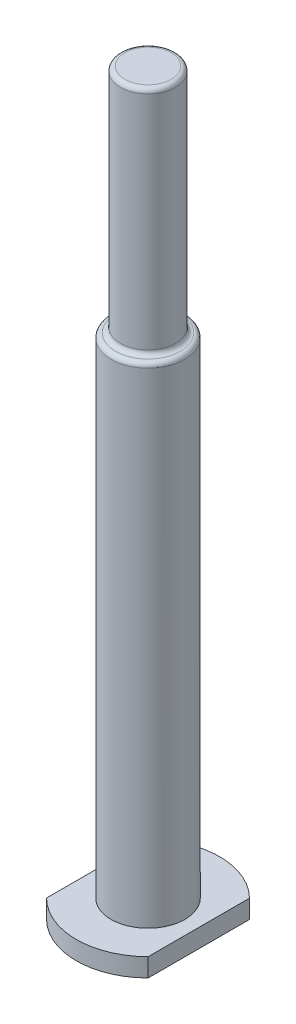
ISO-10303-21;
HEADER;
FILE_DESCRIPTION(('STEP AP214'),'2;1');
FILE_NAME('part.step','',(''),(''),'','','');
FILE_SCHEMA(('AUTOMOTIVE_DESIGN { 1 0 10303 214 1 1 1 1 }'));
ENDSEC;
DATA;
#1=APPLICATION_CONTEXT('core data for automotive mechanical design processes');
#2=APPLICATION_PROTOCOL_DEFINITION('international standard','automotive_design',2000,#1);
#3=PRODUCT_CONTEXT('',#1,'mechanical');
#4=PRODUCT('Part','Part','',(#3));
#5=PRODUCT_RELATED_PRODUCT_CATEGORY('part','',(#4));
#6=PRODUCT_DEFINITION_FORMATION('','',#4);
#7=PRODUCT_DEFINITION_CONTEXT('part definition',#1,'design');
#8=PRODUCT_DEFINITION('design','',#6,#7);
#9=PRODUCT_DEFINITION_SHAPE('','',#8);
#10=(LENGTH_UNIT() NAMED_UNIT(*) SI_UNIT(.MILLI.,.METRE.));
#11=(NAMED_UNIT(*) PLANE_ANGLE_UNIT() SI_UNIT($,.RADIAN.));
#12=(NAMED_UNIT(*) SI_UNIT($,.STERADIAN.) SOLID_ANGLE_UNIT());
#13=UNCERTAINTY_MEASURE_WITH_UNIT(LENGTH_MEASURE(1.E-05),#10,'distance_accuracy_value','');
#14=(GEOMETRIC_REPRESENTATION_CONTEXT(3) GLOBAL_UNCERTAINTY_ASSIGNED_CONTEXT((#13)) GLOBAL_UNIT_ASSIGNED_CONTEXT((#10,
#11,#12)) REPRESENTATION_CONTEXT('',''));
#15=CARTESIAN_POINT('',(0.,0.,0.));
#16=DIRECTION('',(0.,0.,1.));
#17=DIRECTION('',(1.,0.,0.));
#18=AXIS2_PLACEMENT_3D('',#15,#16,#17);
#19=CARTESIAN_POINT('',(0.,26.25,0.));
#20=DIRECTION('',(0.,1.,0.));
#21=DIRECTION('',(0.,0.,-1.));
#22=AXIS2_PLACEMENT_3D('',#19,#20,#21);
#23=CYLINDRICAL_SURFACE('',#22,4.);
#24=CARTESIAN_POINT('',(0.,52.5,0.));
#25=DIRECTION('',(0.,1.,0.));
#26=DIRECTION('',(1.,0.,0.));
#27=AXIS2_PLACEMENT_3D('',#24,#25,#26);
#28=CIRCLE('',#27,4.);
#29=CARTESIAN_POINT('',(0.,52.5,-4.));
#30=VERTEX_POINT('',#29);
#31=CARTESIAN_POINT('',(0.,52.5,4.));
#32=VERTEX_POINT('',#31);
#33=EDGE_CURVE('E117',#30,#32,#28,.T.);
#34=ORIENTED_EDGE('',*,*,#33,.F.);
#35=CARTESIAN_POINT('',(0.,52.5,0.));
#36=DIRECTION('',(0.,1.,0.));
#37=DIRECTION('',(1.,0.,0.));
#38=AXIS2_PLACEMENT_3D('',#35,#36,#37);
#39=CIRCLE('',#38,4.);
#40=EDGE_CURVE('E115',#32,#30,#39,.T.);
#41=ORIENTED_EDGE('',*,*,#40,.F.);
#42=DIRECTION('',(0.,-1.,0.));
#43=VECTOR('',#42,1.);
#44=CARTESIAN_POINT('',(0.,26.25,4.));
#45=LINE('',#44,#43);
#46=CARTESIAN_POINT('',(0.,0.,4.));
#47=VERTEX_POINT('',#46);
#48=EDGE_CURVE('E11',#32,#47,#45,.T.);
#49=ORIENTED_EDGE('',*,*,#48,.T.);
#50=CARTESIAN_POINT('',(0.,0.,0.));
#51=DIRECTION('',(0.,1.,0.));
#52=DIRECTION('',(1.,0.,0.));
#53=AXIS2_PLACEMENT_3D('',#50,#51,#52);
#54=CIRCLE('',#53,4.);
#55=EDGE_CURVE('E114',#47,#47,#54,.T.);
#56=ORIENTED_EDGE('',*,*,#55,.T.);
#57=ORIENTED_EDGE('',*,*,#48,.F.);
#58=EDGE_LOOP('',(#34,#41,#49,#56,#57));
#59=FACE_BOUND('',#58,.T.);
#60=ADVANCED_FACE('F17',(#59),#23,.T.);
#61=CARTESIAN_POINT('',(0.,78.,0.));
#62=DIRECTION('',(0.,1.,0.));
#63=DIRECTION('',(1.,0.,0.));
#64=AXIS2_PLACEMENT_3D('',#61,#62,#63);
#65=PLANE('',#64);
#66=CARTESIAN_POINT('',(0.,78.,0.));
#67=DIRECTION('',(0.,1.,0.));
#68=DIRECTION('',(1.,0.,0.));
#69=AXIS2_PLACEMENT_3D('',#66,#67,#68);
#70=CIRCLE('',#69,2.5);
#71=CARTESIAN_POINT('',(0.,78.,-2.5));
#72=VERTEX_POINT('',#71);
#73=EDGE_CURVE('E178',#72,#72,#70,.T.);
#74=ORIENTED_EDGE('',*,*,#73,.T.);
#75=EDGE_LOOP('',(#74));
#76=FACE_BOUND('',#75,.T.);
#77=ADVANCED_FACE('F231',(#76),#65,.T.);
#78=CARTESIAN_POINT('',(0.,77.5,0.));
#79=DIRECTION('',(0.,1.,0.));
#80=DIRECTION('',(0.,0.,1.));
#81=AXIS2_PLACEMENT_3D('',#78,#79,#80);
#82=TOROIDAL_SURFACE('',#81,2.5,0.5);
#83=ORIENTED_EDGE('',*,*,#73,.F.);
#84=CARTESIAN_POINT('',(0.,77.5,-2.5));
#85=DIRECTION('',(-1.,0.,0.));
#86=DIRECTION('',(0.,0.,-1.));
#87=AXIS2_PLACEMENT_3D('',#84,#85,#86);
#88=CIRCLE('',#87,0.5);
#89=CARTESIAN_POINT('',(0.,77.5,-3.));
#90=VERTEX_POINT('',#89);
#91=EDGE_CURVE('E27',#72,#90,#88,.T.);
#92=ORIENTED_EDGE('',*,*,#91,.T.);
#93=CARTESIAN_POINT('',(0.,77.5,0.));
#94=DIRECTION('',(0.,1.,0.));
#95=DIRECTION('',(1.,0.,0.));
#96=AXIS2_PLACEMENT_3D('',#93,#94,#95);
#97=CIRCLE('',#96,3.);
#98=CARTESIAN_POINT('',(0.,77.5,3.));
#99=VERTEX_POINT('',#98);
#100=EDGE_CURVE('E155',#90,#99,#97,.T.);
#101=ORIENTED_EDGE('',*,*,#100,.T.);
#102=CARTESIAN_POINT('',(0.,77.5,0.));
#103=DIRECTION('',(0.,1.,0.));
#104=DIRECTION('',(1.,0.,0.));
#105=AXIS2_PLACEMENT_3D('',#102,#103,#104);
#106=CIRCLE('',#105,3.);
#107=EDGE_CURVE('E159',#99,#90,#106,.T.);
#108=ORIENTED_EDGE('',*,*,#107,.T.);
#109=ORIENTED_EDGE('',*,*,#91,.F.);
#110=EDGE_LOOP('',(#83,#92,#101,#108,#109));
#111=FACE_BOUND('',#110,.T.);
#112=ADVANCED_FACE('F221',(#111),#82,.T.);
#113=CARTESIAN_POINT('',(0.,65.5,0.));
#114=DIRECTION('',(0.,1.,0.));
#115=DIRECTION('',(0.,0.,-1.));
#116=AXIS2_PLACEMENT_3D('',#113,#114,#115);
#117=CYLINDRICAL_SURFACE('',#116,3.);
#118=ORIENTED_EDGE('',*,*,#100,.F.);
#119=ORIENTED_EDGE('',*,*,#107,.F.);
#120=DIRECTION('',(0.,-1.,0.));
#121=VECTOR('',#120,1.);
#122=CARTESIAN_POINT('',(0.,65.5,3.));
#123=LINE('',#122,#121);
#124=CARTESIAN_POINT('',(0.,53.5,3.));
#125=VERTEX_POINT('',#124);
#126=EDGE_CURVE('E179',#99,#125,#123,.T.);
#127=ORIENTED_EDGE('',*,*,#126,.T.);
#128=CARTESIAN_POINT('',(0.,53.5,0.));
#129=DIRECTION('',(0.,1.,0.));
#130=DIRECTION('',(1.,0.,0.));
#131=AXIS2_PLACEMENT_3D('',#128,#129,#130);
#132=CIRCLE('',#131,3.);
#133=CARTESIAN_POINT('',(0.,53.5,-3.));
#134=VERTEX_POINT('',#133);
#135=EDGE_CURVE('E188',#125,#134,#132,.T.);
#136=ORIENTED_EDGE('',*,*,#135,.T.);
#137=CARTESIAN_POINT('',(0.,53.5,0.));
#138=DIRECTION('',(0.,1.,0.));
#139=DIRECTION('',(1.,0.,0.));
#140=AXIS2_PLACEMENT_3D('',#137,#138,#139);
#141=CIRCLE('',#140,3.);
#142=EDGE_CURVE('E160',#134,#125,#141,.T.);
#143=ORIENTED_EDGE('',*,*,#142,.T.);
#144=ORIENTED_EDGE('',*,*,#126,.F.);
#145=EDGE_LOOP('',(#118,#119,#127,#136,#143,#144));
#146=FACE_BOUND('',#145,.T.);
#147=ADVANCED_FACE('F223',(#146),#117,.T.);
#148=CARTESIAN_POINT('',(0.,53.5,0.));
#149=DIRECTION('',(0.,1.,0.));
#150=DIRECTION('',(0.,0.,1.));
#151=AXIS2_PLACEMENT_3D('',#148,#149,#150);
#152=TOROIDAL_SURFACE('',#151,3.5,0.499999999999994);
#153=CARTESIAN_POINT('',(0.,53.,0.));
#154=DIRECTION('',(0.,1.,0.));
#155=DIRECTION('',(1.,0.,0.));
#156=AXIS2_PLACEMENT_3D('',#153,#154,#155);
#157=CIRCLE('',#156,3.5);
#158=CARTESIAN_POINT('',(0.,53.,-3.5));
#159=VERTEX_POINT('',#158);
#160=EDGE_CURVE('E124',#159,#159,#157,.T.);
#161=ORIENTED_EDGE('',*,*,#160,.T.);
#162=CARTESIAN_POINT('',(0.,53.5,-3.5));
#163=DIRECTION('',(-1.,0.,0.));
#164=DIRECTION('',(0.,0.,-1.));
#165=AXIS2_PLACEMENT_3D('',#162,#163,#164);
#166=CIRCLE('',#165,0.499999999999994);
#167=EDGE_CURVE('E20',#159,#134,#166,.T.);
#168=ORIENTED_EDGE('',*,*,#167,.T.);
#169=ORIENTED_EDGE('',*,*,#135,.F.);
#170=ORIENTED_EDGE('',*,*,#142,.F.);
#171=ORIENTED_EDGE('',*,*,#167,.F.);
#172=EDGE_LOOP('',(#161,#168,#169,#170,#171));
#173=FACE_BOUND('',#172,.T.);
#174=ADVANCED_FACE('F217',(#173),#152,.F.);
#175=CARTESIAN_POINT('',(0.,52.5,0.));
#176=DIRECTION('',(0.,1.,0.));
#177=DIRECTION('',(0.,0.,1.));
#178=AXIS2_PLACEMENT_3D('',#175,#176,#177);
#179=TOROIDAL_SURFACE('',#178,3.5,0.5);
#180=ORIENTED_EDGE('',*,*,#160,.F.);
#181=CARTESIAN_POINT('',(0.,52.5,-3.5));
#182=DIRECTION('',(-1.,0.,0.));
#183=DIRECTION('',(0.,0.,-1.));
#184=AXIS2_PLACEMENT_3D('',#181,#182,#183);
#185=CIRCLE('',#184,0.5);
#186=EDGE_CURVE('E121',#159,#30,#185,.T.);
#187=ORIENTED_EDGE('',*,*,#186,.T.);
#188=ORIENTED_EDGE('',*,*,#33,.T.);
#189=ORIENTED_EDGE('',*,*,#40,.T.);
#190=ORIENTED_EDGE('',*,*,#186,.F.);
#191=EDGE_LOOP('',(#180,#187,#188,#189,#190));
#192=FACE_BOUND('',#191,.T.);
#193=ADVANCED_FACE('F123',(#192),#179,.T.);
#194=CARTESIAN_POINT('',(0.,-2.,0.));
#195=DIRECTION('',(0.,-1.,0.));
#196=DIRECTION('',(0.,0.,-1.));
#197=AXIS2_PLACEMENT_3D('',#194,#195,#196);
#198=PLANE('',#197);
#199=DIRECTION('',(0.,0.,1.));
#200=VECTOR('',#199,1.);
#201=CARTESIAN_POINT('',(5.5,-2.,-5.48143418772513));
#202=LINE('',#201,#200);
#203=CARTESIAN_POINT('',(5.5,-2.,-5.48143418772513));
#204=VERTEX_POINT('',#203);
#205=CARTESIAN_POINT('',(5.5,-2.,5.48143418772514));
#206=VERTEX_POINT('',#205);
#207=EDGE_CURVE('E83',#204,#206,#202,.T.);
#208=ORIENTED_EDGE('',*,*,#207,.T.);
#209=CARTESIAN_POINT('',(0.,-2.,0.));
#210=DIRECTION('',(0.,-1.,0.));
#211=DIRECTION('',(0.708301242249524,0.,0.705910298995404));
#212=AXIS2_PLACEMENT_3D('',#209,#210,#211);
#213=CIRCLE('',#212,7.76505767875306);
#214=CARTESIAN_POINT('',(-5.5,-2.,5.48143418772514));
#215=VERTEX_POINT('',#214);
#216=EDGE_CURVE('E138',#206,#215,#213,.T.);
#217=ORIENTED_EDGE('',*,*,#216,.T.);
#218=DIRECTION('',(0.,0.,-1.));
#219=VECTOR('',#218,1.);
#220=CARTESIAN_POINT('',(-5.5,-2.,5.48143418772514));
#221=LINE('',#220,#219);
#222=CARTESIAN_POINT('',(-5.5,-2.,-5.48143418772513));
#223=VERTEX_POINT('',#222);
#224=EDGE_CURVE('E139',#215,#223,#221,.T.);
#225=ORIENTED_EDGE('',*,*,#224,.T.);
#226=CARTESIAN_POINT('',(0.,-2.,0.));
#227=DIRECTION('',(0.,-1.,0.));
#228=DIRECTION('',(-0.708301242249524,0.,-0.705910298995404));
#229=AXIS2_PLACEMENT_3D('',#226,#227,#228);
#230=CIRCLE('',#229,7.76505767875306);
#231=EDGE_CURVE('E145',#223,#204,#230,.T.);
#232=ORIENTED_EDGE('',*,*,#231,.T.);
#233=EDGE_LOOP('',(#208,#217,#225,#232));
#234=FACE_BOUND('',#233,.T.);
#235=ADVANCED_FACE('F243',(#234),#198,.T.);
#236=CARTESIAN_POINT('',(5.5,0.,-5.48143418772513));
#237=DIRECTION('',(1.,0.,0.));
#238=DIRECTION('',(0.,0.,1.));
#239=AXIS2_PLACEMENT_3D('',#236,#237,#238);
#240=PLANE('',#239);
#241=DIRECTION('',(0.,0.,1.));
#242=VECTOR('',#241,1.);
#243=CARTESIAN_POINT('',(5.5,0.,-5.48143418772513));
#244=LINE('',#243,#242);
#245=CARTESIAN_POINT('',(5.5,0.,-5.48143418772513));
#246=VERTEX_POINT('',#245);
#247=CARTESIAN_POINT('',(5.5,0.,5.48143418772514));
#248=VERTEX_POINT('',#247);
#249=EDGE_CURVE('E195',#246,#248,#244,.T.);
#250=ORIENTED_EDGE('',*,*,#249,.T.);
#251=DIRECTION('',(0.,-1.,0.));
#252=VECTOR('',#251,1.);
#253=CARTESIAN_POINT('',(5.5,0.,5.48143418772514));
#254=LINE('',#253,#252);
#255=EDGE_CURVE('E151',#248,#206,#254,.T.);
#256=ORIENTED_EDGE('',*,*,#255,.T.);
#257=ORIENTED_EDGE('',*,*,#207,.F.);
#258=DIRECTION('',(0.,-1.,0.));
#259=VECTOR('',#258,1.);
#260=CARTESIAN_POINT('',(5.5,0.,-5.48143418772513));
#261=LINE('',#260,#259);
#262=EDGE_CURVE('E149',#246,#204,#261,.T.);
#263=ORIENTED_EDGE('',*,*,#262,.F.);
#264=EDGE_LOOP('',(#250,#256,#257,#263));
#265=FACE_BOUND('',#264,.T.);
#266=ADVANCED_FACE('F246',(#265),#240,.T.);
#267=CARTESIAN_POINT('',(0.,0.,0.));
#268=DIRECTION('',(0.,-1.,0.));
#269=DIRECTION('',(0.708301242249524,0.,0.705910298995404));
#270=AXIS2_PLACEMENT_3D('',#267,#268,#269);
#271=CYLINDRICAL_SURFACE('',#270,7.76505767875306);
#272=CARTESIAN_POINT('',(0.,0.,0.));
#273=DIRECTION('',(0.,-1.,0.));
#274=DIRECTION('',(0.708301242249524,0.,0.705910298995404));
#275=AXIS2_PLACEMENT_3D('',#272,#273,#274);
#276=CIRCLE('',#275,7.76505767875306);
#277=CARTESIAN_POINT('',(-5.5,0.,5.48143418772514));
#278=VERTEX_POINT('',#277);
#279=EDGE_CURVE('E140',#248,#278,#276,.T.);
#280=ORIENTED_EDGE('',*,*,#279,.T.);
#281=DIRECTION('',(0.,-1.,0.));
#282=VECTOR('',#281,1.);
#283=CARTESIAN_POINT('',(-5.5,0.,5.48143418772514));
#284=LINE('',#283,#282);
#285=EDGE_CURVE('E134',#278,#215,#284,.T.);
#286=ORIENTED_EDGE('',*,*,#285,.T.);
#287=ORIENTED_EDGE('',*,*,#216,.F.);
#288=ORIENTED_EDGE('',*,*,#255,.F.);
#289=EDGE_LOOP('',(#280,#286,#287,#288));
#290=FACE_BOUND('',#289,.T.);
#291=ADVANCED_FACE('F247',(#290),#271,.T.);
#292=CARTESIAN_POINT('',(-5.5,0.,5.48143418772514));
#293=DIRECTION('',(-1.,0.,0.));
#294=DIRECTION('',(0.,0.,1.));
#295=AXIS2_PLACEMENT_3D('',#292,#293,#294);
#296=PLANE('',#295);
#297=DIRECTION('',(0.,0.,-1.));
#298=VECTOR('',#297,1.);
#299=CARTESIAN_POINT('',(-5.5,0.,5.48143418772514));
#300=LINE('',#299,#298);
#301=CARTESIAN_POINT('',(-5.5,0.,-5.48143418772513));
#302=VERTEX_POINT('',#301);
#303=EDGE_CURVE('E144',#278,#302,#300,.T.);
#304=ORIENTED_EDGE('',*,*,#303,.T.);
#305=DIRECTION('',(0.,-1.,0.));
#306=VECTOR('',#305,1.);
#307=CARTESIAN_POINT('',(-5.5,0.,-5.48143418772513));
#308=LINE('',#307,#306);
#309=EDGE_CURVE('E148',#302,#223,#308,.T.);
#310=ORIENTED_EDGE('',*,*,#309,.T.);
#311=ORIENTED_EDGE('',*,*,#224,.F.);
#312=ORIENTED_EDGE('',*,*,#285,.F.);
#313=EDGE_LOOP('',(#304,#310,#311,#312));
#314=FACE_BOUND('',#313,.T.);
#315=ADVANCED_FACE('F250',(#314),#296,.T.);
#316=CARTESIAN_POINT('',(0.,0.,0.));
#317=DIRECTION('',(0.,-1.,0.));
#318=DIRECTION('',(-0.708301242249524,0.,-0.705910298995404));
#319=AXIS2_PLACEMENT_3D('',#316,#317,#318);
#320=CYLINDRICAL_SURFACE('',#319,7.76505767875306);
#321=CARTESIAN_POINT('',(0.,0.,0.));
#322=DIRECTION('',(0.,-1.,0.));
#323=DIRECTION('',(-0.708301242249524,0.,-0.705910298995404));
#324=AXIS2_PLACEMENT_3D('',#321,#322,#323);
#325=CIRCLE('',#324,7.76505767875306);
#326=EDGE_CURVE('E191',#302,#246,#325,.T.);
#327=ORIENTED_EDGE('',*,*,#326,.T.);
#328=ORIENTED_EDGE('',*,*,#262,.T.);
#329=ORIENTED_EDGE('',*,*,#231,.F.);
#330=ORIENTED_EDGE('',*,*,#309,.F.);
#331=EDGE_LOOP('',(#327,#328,#329,#330));
#332=FACE_BOUND('',#331,.T.);
#333=ADVANCED_FACE('F257',(#332),#320,.T.);
#334=CARTESIAN_POINT('',(0.,0.,0.));
#335=DIRECTION('',(0.,-1.,0.));
#336=DIRECTION('',(0.,0.,-1.));
#337=AXIS2_PLACEMENT_3D('',#334,#335,#336);
#338=PLANE('',#337);
#339=ORIENTED_EDGE('',*,*,#55,.F.);
#340=EDGE_LOOP('',(#339));
#341=FACE_BOUND('',#340,.T.);
#342=ORIENTED_EDGE('',*,*,#249,.F.);
#343=ORIENTED_EDGE('',*,*,#326,.F.);
#344=ORIENTED_EDGE('',*,*,#303,.F.);
#345=ORIENTED_EDGE('',*,*,#279,.F.);
#346=EDGE_LOOP('',(#342,#343,#344,#345));
#347=FACE_BOUND('',#346,.T.);
#348=ADVANCED_FACE('F254',(#341,#347),#338,.F.);
#349=CLOSED_SHELL('',(#60,#77,#112,#147,#174,#193,#235,#266,#291,#315,#333,#348));
#350=MANIFOLD_SOLID_BREP('B1',#349);
#351=ADVANCED_BREP_SHAPE_REPRESENTATION('',(#18,#350),#14);
#352=SHAPE_DEFINITION_REPRESENTATION(#9,#351);
ENDSEC;
END-ISO-10303-21;
